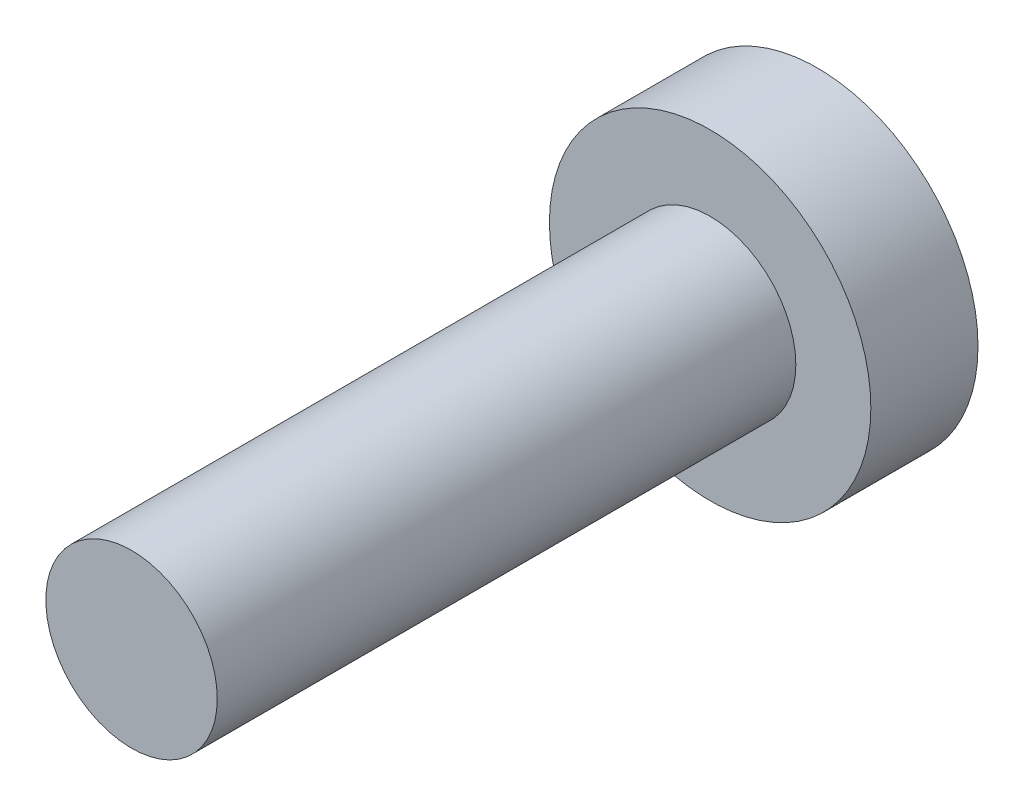
ISO-10303-21;
HEADER;
FILE_DESCRIPTION(('STEP AP214'),'2;1');
FILE_NAME('part.step','',(''),(''),'','','');
FILE_SCHEMA(('AUTOMOTIVE_DESIGN { 1 0 10303 214 1 1 1 1 }'));
ENDSEC;
DATA;
#1=APPLICATION_CONTEXT('core data for automotive mechanical design processes');
#2=APPLICATION_PROTOCOL_DEFINITION('international standard','automotive_design',2000,#1);
#3=PRODUCT_CONTEXT('',#1,'mechanical');
#4=PRODUCT('Part','Part','',(#3));
#5=PRODUCT_RELATED_PRODUCT_CATEGORY('part','',(#4));
#6=PRODUCT_DEFINITION_FORMATION('','',#4);
#7=PRODUCT_DEFINITION_CONTEXT('part definition',#1,'design');
#8=PRODUCT_DEFINITION('design','',#6,#7);
#9=PRODUCT_DEFINITION_SHAPE('','',#8);
#10=(LENGTH_UNIT() NAMED_UNIT(*) SI_UNIT(.MILLI.,.METRE.));
#11=(NAMED_UNIT(*) PLANE_ANGLE_UNIT() SI_UNIT($,.RADIAN.));
#12=(NAMED_UNIT(*) SI_UNIT($,.STERADIAN.) SOLID_ANGLE_UNIT());
#13=UNCERTAINTY_MEASURE_WITH_UNIT(LENGTH_MEASURE(1.E-05),#10,'distance_accuracy_value','');
#14=(GEOMETRIC_REPRESENTATION_CONTEXT(3) GLOBAL_UNCERTAINTY_ASSIGNED_CONTEXT((#13)) GLOBAL_UNIT_ASSIGNED_CONTEXT((#10,
#11,#12)) REPRESENTATION_CONTEXT('',''));
#15=CARTESIAN_POINT('',(0.,0.,0.));
#16=DIRECTION('',(0.,0.,1.));
#17=DIRECTION('',(1.,0.,0.));
#18=AXIS2_PLACEMENT_3D('',#15,#16,#17);
#19=CARTESIAN_POINT('',(0.,0.,0.));
#20=DIRECTION('',(0.,0.,1.));
#21=DIRECTION('',(1.,0.,0.));
#22=AXIS2_PLACEMENT_3D('',#19,#20,#21);
#23=PLANE('',#22);
#24=CARTESIAN_POINT('',(0.,0.,0.));
#25=DIRECTION('',(0.,0.,1.));
#26=DIRECTION('',(1.,0.,0.));
#27=AXIS2_PLACEMENT_3D('',#24,#25,#26);
#28=CIRCLE('',#27,3.75);
#29=CARTESIAN_POINT('',(3.75,0.,0.));
#30=VERTEX_POINT('',#29);
#31=EDGE_CURVE('E50',#30,#30,#28,.T.);
#32=ORIENTED_EDGE('',*,*,#31,.F.);
#33=EDGE_LOOP('',(#32));
#34=FACE_BOUND('',#33,.T.);
#35=DIRECTION('',(0.866025403784441,-0.499999999999995,0.));
#36=VECTOR('',#35,1.);
#37=CARTESIAN_POINT('',(-1.24999999999999,-0.721687836487047,0.));
#38=LINE('',#37,#36);
#39=CARTESIAN_POINT('',(-1.24999999999999,-0.721687836487047,0.));
#40=VERTEX_POINT('',#39);
#41=CARTESIAN_POINT('',(0.,-1.44337567297406,0.));
#42=VERTEX_POINT('',#41);
#43=EDGE_CURVE('E56',#40,#42,#38,.T.);
#44=ORIENTED_EDGE('',*,*,#43,.T.);
#45=DIRECTION('',(0.866025403784438,0.500000000000001,0.));
#46=VECTOR('',#45,1.);
#47=CARTESIAN_POINT('',(0.,-1.44337567297406,0.));
#48=LINE('',#47,#46);
#49=CARTESIAN_POINT('',(1.25,-0.721687836487029,0.));
#50=VERTEX_POINT('',#49);
#51=EDGE_CURVE('E140',#42,#50,#48,.T.);
#52=ORIENTED_EDGE('',*,*,#51,.T.);
#53=DIRECTION('',(0.,1.,0.));
#54=VECTOR('',#53,1.);
#55=CARTESIAN_POINT('',(1.25,-0.721687836487029,0.));
#56=LINE('',#55,#54);
#57=CARTESIAN_POINT('',(1.25,0.721687836487038,0.));
#58=VERTEX_POINT('',#57);
#59=EDGE_CURVE('E143',#50,#58,#56,.T.);
#60=ORIENTED_EDGE('',*,*,#59,.T.);
#61=DIRECTION('',(-0.866025403784442,0.499999999999995,0.));
#62=VECTOR('',#61,1.);
#63=CARTESIAN_POINT('',(1.25,0.721687836487038,0.));
#64=LINE('',#63,#62);
#65=CARTESIAN_POINT('',(0.,1.44337567297406,0.));
#66=VERTEX_POINT('',#65);
#67=EDGE_CURVE('E144',#58,#66,#64,.T.);
#68=ORIENTED_EDGE('',*,*,#67,.T.);
#69=DIRECTION('',(-0.866025403784434,-0.500000000000007,0.));
#70=VECTOR('',#69,1.);
#71=CARTESIAN_POINT('',(0.,1.44337567297406,0.));
#72=LINE('',#71,#70);
#73=CARTESIAN_POINT('',(-1.25000000000001,0.721687836487021,0.));
#74=VERTEX_POINT('',#73);
#75=EDGE_CURVE('E122',#66,#74,#72,.T.);
#76=ORIENTED_EDGE('',*,*,#75,.T.);
#77=DIRECTION('',(0.,-1.,0.));
#78=VECTOR('',#77,1.);
#79=CARTESIAN_POINT('',(-1.25000000000001,0.721687836487021,0.));
#80=LINE('',#79,#78);
#81=EDGE_CURVE('E147',#74,#40,#80,.T.);
#82=ORIENTED_EDGE('',*,*,#81,.T.);
#83=EDGE_LOOP('',(#44,#52,#60,#68,#76,#82));
#84=FACE_BOUND('',#83,.T.);
#85=ADVANCED_FACE('F43',(#34,#84),#23,.F.);
#86=CARTESIAN_POINT('',(0.,0.,2.5));
#87=DIRECTION('',(0.,0.,-1.));
#88=DIRECTION('',(-1.,0.,0.));
#89=AXIS2_PLACEMENT_3D('',#86,#87,#88);
#90=CYLINDRICAL_SURFACE('',#89,3.75);
#91=CARTESIAN_POINT('',(0.,0.,2.5));
#92=DIRECTION('',(0.,0.,1.));
#93=DIRECTION('',(1.,0.,0.));
#94=AXIS2_PLACEMENT_3D('',#91,#92,#93);
#95=CIRCLE('',#94,3.75);
#96=CARTESIAN_POINT('',(3.75,0.,2.5));
#97=VERTEX_POINT('',#96);
#98=EDGE_CURVE('E11',#97,#97,#95,.T.);
#99=ORIENTED_EDGE('',*,*,#98,.F.);
#100=EDGE_LOOP('',(#99));
#101=FACE_BOUND('',#100,.T.);
#102=ORIENTED_EDGE('',*,*,#31,.T.);
#103=EDGE_LOOP('',(#102));
#104=FACE_BOUND('',#103,.T.);
#105=ADVANCED_FACE('F44',(#101,#104),#90,.T.);
#106=CARTESIAN_POINT('',(0.,0.,2.5));
#107=DIRECTION('',(0.,0.,1.));
#108=DIRECTION('',(1.,0.,0.));
#109=AXIS2_PLACEMENT_3D('',#106,#107,#108);
#110=PLANE('',#109);
#111=CARTESIAN_POINT('',(0.,0.,2.5));
#112=DIRECTION('',(0.,0.,1.));
#113=DIRECTION('',(1.,0.,0.));
#114=AXIS2_PLACEMENT_3D('',#111,#112,#113);
#115=CIRCLE('',#114,2.);
#116=CARTESIAN_POINT('',(2.,0.,2.5));
#117=VERTEX_POINT('',#116);
#118=EDGE_CURVE('E166',#117,#117,#115,.F.);
#119=ORIENTED_EDGE('',*,*,#118,.T.);
#120=EDGE_LOOP('',(#119));
#121=FACE_BOUND('',#120,.T.);
#122=ORIENTED_EDGE('',*,*,#98,.T.);
#123=EDGE_LOOP('',(#122));
#124=FACE_BOUND('',#123,.T.);
#125=ADVANCED_FACE('F211',(#121,#124),#110,.T.);
#126=CARTESIAN_POINT('',(0.,0.,16.));
#127=DIRECTION('',(0.,0.,-1.));
#128=DIRECTION('',(-1.,0.,0.));
#129=AXIS2_PLACEMENT_3D('',#126,#127,#128);
#130=CYLINDRICAL_SURFACE('',#129,2.);
#131=ORIENTED_EDGE('',*,*,#118,.F.);
#132=EDGE_LOOP('',(#131));
#133=FACE_BOUND('',#132,.T.);
#134=CARTESIAN_POINT('',(0.,0.,16.));
#135=DIRECTION('',(0.,0.,1.));
#136=DIRECTION('',(1.,0.,0.));
#137=AXIS2_PLACEMENT_3D('',#134,#135,#136);
#138=CIRCLE('',#137,2.);
#139=CARTESIAN_POINT('',(2.,0.,16.));
#140=VERTEX_POINT('',#139);
#141=EDGE_CURVE('E164',#140,#140,#138,.T.);
#142=ORIENTED_EDGE('',*,*,#141,.F.);
#143=EDGE_LOOP('',(#142));
#144=FACE_BOUND('',#143,.T.);
#145=ADVANCED_FACE('F210',(#133,#144),#130,.T.);
#146=CARTESIAN_POINT('',(0.,0.,16.));
#147=DIRECTION('',(0.,0.,1.));
#148=DIRECTION('',(1.,0.,0.));
#149=AXIS2_PLACEMENT_3D('',#146,#147,#148);
#150=PLANE('',#149);
#151=ORIENTED_EDGE('',*,*,#141,.T.);
#152=EDGE_LOOP('',(#151));
#153=FACE_BOUND('',#152,.T.);
#154=ADVANCED_FACE('F203',(#153),#150,.T.);
#155=CARTESIAN_POINT('',(-1.24999999999999,-0.721687836487047,1.5));
#156=DIRECTION('',(0.499999999999995,0.866025403784441,0.));
#157=DIRECTION('',(-0.866025403784442,0.499999999999995,0.));
#158=AXIS2_PLACEMENT_3D('',#155,#156,#157);
#159=PLANE('',#158);
#160=ORIENTED_EDGE('',*,*,#43,.F.);
#161=DIRECTION('',(0.,0.,-1.));
#162=VECTOR('',#161,1.);
#163=CARTESIAN_POINT('',(-1.24999999999999,-0.721687836487047,1.5));
#164=LINE('',#163,#162);
#165=CARTESIAN_POINT('',(-1.24999999999999,-0.721687836487047,1.5));
#166=VERTEX_POINT('',#165);
#167=EDGE_CURVE('E132',#166,#40,#164,.T.);
#168=ORIENTED_EDGE('',*,*,#167,.F.);
#169=DIRECTION('',(0.866025403784441,-0.499999999999995,0.));
#170=VECTOR('',#169,1.);
#171=CARTESIAN_POINT('',(-1.24999999999999,-0.721687836487047,1.5));
#172=LINE('',#171,#170);
#173=CARTESIAN_POINT('',(0.,-1.44337567297406,1.5));
#174=VERTEX_POINT('',#173);
#175=EDGE_CURVE('E152',#166,#174,#172,.T.);
#176=ORIENTED_EDGE('',*,*,#175,.T.);
#177=DIRECTION('',(0.,0.,-1.));
#178=VECTOR('',#177,1.);
#179=CARTESIAN_POINT('',(0.,-1.44337567297406,1.5));
#180=LINE('',#179,#178);
#181=EDGE_CURVE('E165',#174,#42,#180,.T.);
#182=ORIENTED_EDGE('',*,*,#181,.T.);
#183=EDGE_LOOP('',(#160,#168,#176,#182));
#184=FACE_BOUND('',#183,.T.);
#185=ADVANCED_FACE('F184',(#184),#159,.T.);
#186=CARTESIAN_POINT('',(0.,-1.44337567297406,1.5));
#187=DIRECTION('',(-0.500000000000001,0.866025403784438,0.));
#188=DIRECTION('',(-0.866025403784438,-0.500000000000001,0.));
#189=AXIS2_PLACEMENT_3D('',#186,#187,#188);
#190=PLANE('',#189);
#191=ORIENTED_EDGE('',*,*,#51,.F.);
#192=ORIENTED_EDGE('',*,*,#181,.F.);
#193=DIRECTION('',(0.866025403784438,0.500000000000001,0.));
#194=VECTOR('',#193,1.);
#195=CARTESIAN_POINT('',(0.,-1.44337567297406,1.5));
#196=LINE('',#195,#194);
#197=CARTESIAN_POINT('',(1.25,-0.721687836487029,1.5));
#198=VERTEX_POINT('',#197);
#199=EDGE_CURVE('E98',#174,#198,#196,.T.);
#200=ORIENTED_EDGE('',*,*,#199,.T.);
#201=DIRECTION('',(0.,0.,-1.));
#202=VECTOR('',#201,1.);
#203=CARTESIAN_POINT('',(1.25,-0.721687836487029,1.5));
#204=LINE('',#203,#202);
#205=EDGE_CURVE('E157',#198,#50,#204,.T.);
#206=ORIENTED_EDGE('',*,*,#205,.T.);
#207=EDGE_LOOP('',(#191,#192,#200,#206));
#208=FACE_BOUND('',#207,.T.);
#209=ADVANCED_FACE('F194',(#208),#190,.T.);
#210=CARTESIAN_POINT('',(1.25,-0.721687836487029,1.5));
#211=DIRECTION('',(-1.,0.,0.));
#212=DIRECTION('',(0.,-1.,0.));
#213=AXIS2_PLACEMENT_3D('',#210,#211,#212);
#214=PLANE('',#213);
#215=ORIENTED_EDGE('',*,*,#59,.F.);
#216=ORIENTED_EDGE('',*,*,#205,.F.);
#217=DIRECTION('',(0.,1.,0.));
#218=VECTOR('',#217,1.);
#219=CARTESIAN_POINT('',(1.25,-0.721687836487029,1.5));
#220=LINE('',#219,#218);
#221=CARTESIAN_POINT('',(1.25,0.721687836487038,1.5));
#222=VERTEX_POINT('',#221);
#223=EDGE_CURVE('E120',#198,#222,#220,.T.);
#224=ORIENTED_EDGE('',*,*,#223,.T.);
#225=DIRECTION('',(0.,0.,-1.));
#226=VECTOR('',#225,1.);
#227=CARTESIAN_POINT('',(1.25,0.721687836487038,1.5));
#228=LINE('',#227,#226);
#229=EDGE_CURVE('E114',#222,#58,#228,.T.);
#230=ORIENTED_EDGE('',*,*,#229,.T.);
#231=EDGE_LOOP('',(#215,#216,#224,#230));
#232=FACE_BOUND('',#231,.T.);
#233=ADVANCED_FACE('F195',(#232),#214,.T.);
#234=CARTESIAN_POINT('',(1.25,0.721687836487038,1.5));
#235=DIRECTION('',(-0.499999999999995,-0.866025403784441,0.));
#236=DIRECTION('',(0.866025403784442,-0.499999999999995,0.));
#237=AXIS2_PLACEMENT_3D('',#234,#235,#236);
#238=PLANE('',#237);
#239=ORIENTED_EDGE('',*,*,#67,.F.);
#240=ORIENTED_EDGE('',*,*,#229,.F.);
#241=DIRECTION('',(-0.866025403784442,0.499999999999995,0.));
#242=VECTOR('',#241,1.);
#243=CARTESIAN_POINT('',(1.25,0.721687836487038,1.5));
#244=LINE('',#243,#242);
#245=CARTESIAN_POINT('',(0.,1.44337567297406,1.5));
#246=VERTEX_POINT('',#245);
#247=EDGE_CURVE('E107',#222,#246,#244,.T.);
#248=ORIENTED_EDGE('',*,*,#247,.T.);
#249=DIRECTION('',(0.,0.,-1.));
#250=VECTOR('',#249,1.);
#251=CARTESIAN_POINT('',(0.,1.44337567297406,1.5));
#252=LINE('',#251,#250);
#253=EDGE_CURVE('E115',#246,#66,#252,.T.);
#254=ORIENTED_EDGE('',*,*,#253,.T.);
#255=EDGE_LOOP('',(#239,#240,#248,#254));
#256=FACE_BOUND('',#255,.T.);
#257=ADVANCED_FACE('F112',(#256),#238,.T.);
#258=CARTESIAN_POINT('',(0.,1.44337567297406,1.5));
#259=DIRECTION('',(0.500000000000007,-0.866025403784435,0.));
#260=DIRECTION('',(0.866025403784434,0.500000000000007,0.));
#261=AXIS2_PLACEMENT_3D('',#258,#259,#260);
#262=PLANE('',#261);
#263=ORIENTED_EDGE('',*,*,#75,.F.);
#264=ORIENTED_EDGE('',*,*,#253,.F.);
#265=DIRECTION('',(-0.866025403784434,-0.500000000000007,0.));
#266=VECTOR('',#265,1.);
#267=CARTESIAN_POINT('',(0.,1.44337567297406,1.5));
#268=LINE('',#267,#266);
#269=CARTESIAN_POINT('',(-1.25000000000001,0.721687836487021,1.5));
#270=VERTEX_POINT('',#269);
#271=EDGE_CURVE('E117',#246,#270,#268,.T.);
#272=ORIENTED_EDGE('',*,*,#271,.T.);
#273=DIRECTION('',(0.,0.,-1.));
#274=VECTOR('',#273,1.);
#275=CARTESIAN_POINT('',(-1.25000000000001,0.721687836487021,1.5));
#276=LINE('',#275,#274);
#277=EDGE_CURVE('E90',#270,#74,#276,.T.);
#278=ORIENTED_EDGE('',*,*,#277,.T.);
#279=EDGE_LOOP('',(#263,#264,#272,#278));
#280=FACE_BOUND('',#279,.T.);
#281=ADVANCED_FACE('F116',(#280),#262,.T.);
#282=CARTESIAN_POINT('',(-1.25000000000001,0.721687836487021,1.5));
#283=DIRECTION('',(1.,0.,0.));
#284=DIRECTION('',(0.,1.,0.));
#285=AXIS2_PLACEMENT_3D('',#282,#283,#284);
#286=PLANE('',#285);
#287=ORIENTED_EDGE('',*,*,#81,.F.);
#288=ORIENTED_EDGE('',*,*,#277,.F.);
#289=DIRECTION('',(0.,-1.,0.));
#290=VECTOR('',#289,1.);
#291=CARTESIAN_POINT('',(-1.25000000000001,0.721687836487021,1.5));
#292=LINE('',#291,#290);
#293=EDGE_CURVE('E70',#270,#166,#292,.T.);
#294=ORIENTED_EDGE('',*,*,#293,.T.);
#295=ORIENTED_EDGE('',*,*,#167,.T.);
#296=EDGE_LOOP('',(#287,#288,#294,#295));
#297=FACE_BOUND('',#296,.T.);
#298=ADVANCED_FACE('F181',(#297),#286,.T.);
#299=CARTESIAN_POINT('',(0.,0.,1.5));
#300=DIRECTION('',(0.,0.,1.));
#301=DIRECTION('',(1.,0.,0.));
#302=AXIS2_PLACEMENT_3D('',#299,#300,#301);
#303=PLANE('',#302);
#304=ORIENTED_EDGE('',*,*,#175,.F.);
#305=ORIENTED_EDGE('',*,*,#293,.F.);
#306=ORIENTED_EDGE('',*,*,#271,.F.);
#307=ORIENTED_EDGE('',*,*,#247,.F.);
#308=ORIENTED_EDGE('',*,*,#223,.F.);
#309=ORIENTED_EDGE('',*,*,#199,.F.);
#310=EDGE_LOOP('',(#304,#305,#306,#307,#308,#309));
#311=FACE_BOUND('',#310,.T.);
#312=ADVANCED_FACE('F121',(#311),#303,.F.);
#313=CLOSED_SHELL('',(#85,#105,#125,#145,#154,#185,#209,#233,#257,#281,#298,#312));
#314=MANIFOLD_SOLID_BREP('B2',#313);
#315=ADVANCED_BREP_SHAPE_REPRESENTATION('',(#18,#314),#14);
#316=SHAPE_DEFINITION_REPRESENTATION(#9,#315);
ENDSEC;
END-ISO-10303-21;
